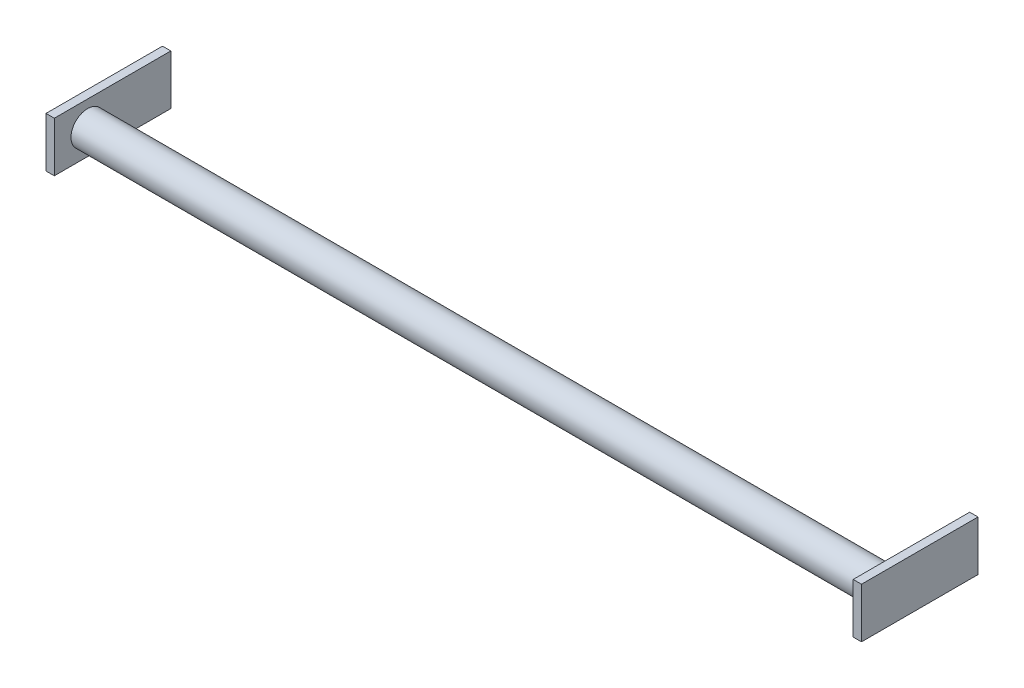
ISO-10303-21;
HEADER;
FILE_DESCRIPTION(('STEP AP214'),'2;1');
FILE_NAME('part.step','',(''),(''),'','','');
FILE_SCHEMA(('AUTOMOTIVE_DESIGN { 1 0 10303 214 1 1 1 1 }'));
ENDSEC;
DATA;
#1=APPLICATION_CONTEXT('core data for automotive mechanical design processes');
#2=APPLICATION_PROTOCOL_DEFINITION('international standard','automotive_design',2000,#1);
#3=PRODUCT_CONTEXT('',#1,'mechanical');
#4=PRODUCT('Part','Part','',(#3));
#5=PRODUCT_RELATED_PRODUCT_CATEGORY('part','',(#4));
#6=PRODUCT_DEFINITION_FORMATION('','',#4);
#7=PRODUCT_DEFINITION_CONTEXT('part definition',#1,'design');
#8=PRODUCT_DEFINITION('design','',#6,#7);
#9=PRODUCT_DEFINITION_SHAPE('','',#8);
#10=(LENGTH_UNIT() NAMED_UNIT(*) SI_UNIT(.MILLI.,.METRE.));
#11=(NAMED_UNIT(*) PLANE_ANGLE_UNIT() SI_UNIT($,.RADIAN.));
#12=(NAMED_UNIT(*) SI_UNIT($,.STERADIAN.) SOLID_ANGLE_UNIT());
#13=UNCERTAINTY_MEASURE_WITH_UNIT(LENGTH_MEASURE(1.E-05),#10,'distance_accuracy_value','');
#14=(GEOMETRIC_REPRESENTATION_CONTEXT(3) GLOBAL_UNCERTAINTY_ASSIGNED_CONTEXT((#13)) GLOBAL_UNIT_ASSIGNED_CONTEXT((#10,
#11,#12)) REPRESENTATION_CONTEXT('',''));
#15=CARTESIAN_POINT('',(0.,0.,0.));
#16=DIRECTION('',(0.,0.,1.));
#17=DIRECTION('',(1.,0.,0.));
#18=AXIS2_PLACEMENT_3D('',#15,#16,#17);
#19=CARTESIAN_POINT('',(304.8,0.,0.));
#20=DIRECTION('',(-1.,0.,0.));
#21=DIRECTION('',(0.,0.,1.));
#22=AXIS2_PLACEMENT_3D('',#19,#20,#21);
#23=CYLINDRICAL_SURFACE('',#22,12.7);
#24=CARTESIAN_POINT('',(304.8,0.,0.));
#25=DIRECTION('',(1.,0.,0.));
#26=DIRECTION('',(0.,0.,-1.));
#27=AXIS2_PLACEMENT_3D('',#24,#25,#26);
#28=CIRCLE('',#27,12.7);
#29=CARTESIAN_POINT('',(304.8,0.,12.7));
#30=VERTEX_POINT('',#29);
#31=EDGE_CURVE('E11',#30,#30,#28,.T.);
#32=CARTESIAN_POINT('',(-304.8,0.,0.));
#33=DIRECTION('',(1.,0.,0.));
#34=DIRECTION('',(0.,0.,-1.));
#35=AXIS2_PLACEMENT_3D('',#32,#33,#34);
#36=CIRCLE('',#35,12.7);
#37=CARTESIAN_POINT('',(-304.8,0.,12.7));
#38=VERTEX_POINT('',#37);
#39=EDGE_CURVE('E42',#38,#38,#36,.T.);
#40=CARTESIAN_POINT('',(304.8,0.,12.7));
#41=CARTESIAN_POINT('',(298.45,0.,12.7));
#42=CARTESIAN_POINT('',(292.1,0.,12.7));
#43=CARTESIAN_POINT('',(279.4,0.,12.7));
#44=CARTESIAN_POINT('',(273.05,0.,12.7));
#45=CARTESIAN_POINT('',(260.35,0.,12.7));
#46=CARTESIAN_POINT('',(254.,0.,12.7));
#47=CARTESIAN_POINT('',(241.3,0.,12.7));
#48=CARTESIAN_POINT('',(234.95,0.,12.7));
#49=CARTESIAN_POINT('',(222.25,0.,12.7));
#50=CARTESIAN_POINT('',(215.9,0.,12.7));
#51=CARTESIAN_POINT('',(203.2,0.,12.7));
#52=CARTESIAN_POINT('',(196.85,0.,12.7));
#53=CARTESIAN_POINT('',(184.15,0.,12.7));
#54=CARTESIAN_POINT('',(177.8,0.,12.7));
#55=CARTESIAN_POINT('',(165.1,0.,12.7));
#56=CARTESIAN_POINT('',(158.75,0.,12.7));
#57=CARTESIAN_POINT('',(146.05,0.,12.7));
#58=CARTESIAN_POINT('',(139.7,0.,12.7));
#59=CARTESIAN_POINT('',(127.,0.,12.7));
#60=CARTESIAN_POINT('',(120.65,0.,12.7));
#61=CARTESIAN_POINT('',(107.95,0.,12.7));
#62=CARTESIAN_POINT('',(101.6,0.,12.7));
#63=CARTESIAN_POINT('',(88.9,0.,12.7));
#64=CARTESIAN_POINT('',(82.55,0.,12.7));
#65=CARTESIAN_POINT('',(69.85,0.,12.7));
#66=CARTESIAN_POINT('',(63.5,0.,12.7));
#67=CARTESIAN_POINT('',(50.8,0.,12.7));
#68=CARTESIAN_POINT('',(44.45,0.,12.7));
#69=CARTESIAN_POINT('',(31.75,0.,12.7));
#70=CARTESIAN_POINT('',(25.4,0.,12.7));
#71=CARTESIAN_POINT('',(12.7,0.,12.7));
#72=CARTESIAN_POINT('',(6.35,0.,12.7));
#73=CARTESIAN_POINT('',(-6.35,0.,12.7));
#74=CARTESIAN_POINT('',(-12.7,0.,12.7));
#75=CARTESIAN_POINT('',(-25.4,0.,12.7));
#76=CARTESIAN_POINT('',(-31.75,0.,12.7));
#77=CARTESIAN_POINT('',(-44.45,0.,12.7));
#78=CARTESIAN_POINT('',(-50.8,0.,12.7));
#79=CARTESIAN_POINT('',(-63.5,0.,12.7));
#80=CARTESIAN_POINT('',(-69.85,0.,12.7));
#81=CARTESIAN_POINT('',(-82.55,0.,12.7));
#82=CARTESIAN_POINT('',(-88.9,0.,12.7));
#83=CARTESIAN_POINT('',(-101.6,0.,12.7));
#84=CARTESIAN_POINT('',(-107.95,0.,12.7));
#85=CARTESIAN_POINT('',(-120.65,0.,12.7));
#86=CARTESIAN_POINT('',(-127.,0.,12.7));
#87=CARTESIAN_POINT('',(-139.7,0.,12.7));
#88=CARTESIAN_POINT('',(-146.05,0.,12.7));
#89=CARTESIAN_POINT('',(-158.75,0.,12.7));
#90=CARTESIAN_POINT('',(-165.1,0.,12.7));
#91=CARTESIAN_POINT('',(-177.8,0.,12.7));
#92=CARTESIAN_POINT('',(-184.15,0.,12.7));
#93=CARTESIAN_POINT('',(-196.85,0.,12.7));
#94=CARTESIAN_POINT('',(-203.2,0.,12.7));
#95=CARTESIAN_POINT('',(-215.9,0.,12.7));
#96=CARTESIAN_POINT('',(-222.25,0.,12.7));
#97=CARTESIAN_POINT('',(-234.95,0.,12.7));
#98=CARTESIAN_POINT('',(-241.3,0.,12.7));
#99=CARTESIAN_POINT('',(-254.,0.,12.7));
#100=CARTESIAN_POINT('',(-260.35,0.,12.7));
#101=CARTESIAN_POINT('',(-273.05,0.,12.7));
#102=CARTESIAN_POINT('',(-279.4,0.,12.7));
#103=CARTESIAN_POINT('',(-292.1,0.,12.7));
#104=CARTESIAN_POINT('',(-298.45,0.,12.7));
#105=CARTESIAN_POINT('',(-304.8,0.,12.7));
#106=B_SPLINE_CURVE_WITH_KNOTS('',3,(#40,#41,#42,#43,#44,#45,#46,#47,#48,#49,#50,#51,#52,#53,
#54,#55,#56,#57,#58,#59,#60,#61,#62,#63,#64,#65,#66,#67,#68,#69,#70,#71,#72,#73,#74,#75,#76,#77,
#78,#79,#80,#81,#82,#83,#84,#85,#86,#87,#88,#89,#90,#91,#92,#93,#94,#95,#96,#97,#98,#99,#100,
#101,#102,#103,#104,#105),.UNSPECIFIED.,.F.,.F.,(4,2,2,2,2,2,2,2,2,2,2,2,2,2,2,2,2,2,2,2,2,2,2,
2,2,2,2,2,2,2,2,2,4),(0.,19.05,38.1,57.15,76.2,95.2500000000001,114.3,133.35,152.4,171.45,190.5,
209.55,228.6,247.65,266.7,285.75,304.8,323.85,342.9,361.95,381.,400.05,419.1,438.15,457.2,
476.25,495.3,514.35,533.4,552.45,571.5,590.55,609.6),.UNSPECIFIED.);
#107=EDGE_CURVE('BSEAM39',#30,#38,#106,.T.);
#108=ORIENTED_EDGE('',*,*,#31,.F.);
#109=ORIENTED_EDGE('',*,*,#39,.T.);
#110=ORIENTED_EDGE('',*,*,#107,.T.);
#111=ORIENTED_EDGE('',*,*,#107,.F.);
#112=EDGE_LOOP('',(#108,#110,#109,#111));
#113=FACE_BOUND('',#112,.T.);
#114=ADVANCED_FACE('F39',(#113),#23,.T.);
#115=CARTESIAN_POINT('',(311.15,19.05,25.4));
#116=DIRECTION('',(0.,0.,-1.));
#117=DIRECTION('',(-1.,0.,0.));
#118=AXIS2_PLACEMENT_3D('',#115,#116,#117);
#119=PLANE('',#118);
#120=DIRECTION('',(0.,-1.,0.));
#121=VECTOR('',#120,1.);
#122=CARTESIAN_POINT('',(304.8,19.05,25.4));
#123=LINE('',#122,#121);
#124=CARTESIAN_POINT('',(304.8,19.05,25.4));
#125=VERTEX_POINT('',#124);
#126=CARTESIAN_POINT('',(304.8,-19.05,25.4));
#127=VERTEX_POINT('',#126);
#128=EDGE_CURVE('E181',#125,#127,#123,.T.);
#129=ORIENTED_EDGE('',*,*,#128,.T.);
#130=DIRECTION('',(-1.,0.,0.));
#131=VECTOR('',#130,1.);
#132=CARTESIAN_POINT('',(311.15,-19.05,25.4));
#133=LINE('',#132,#131);
#134=CARTESIAN_POINT('',(311.15,-19.05,25.4));
#135=VERTEX_POINT('',#134);
#136=EDGE_CURVE('E49',#135,#127,#133,.T.);
#137=ORIENTED_EDGE('',*,*,#136,.F.);
#138=DIRECTION('',(0.,-1.,0.));
#139=VECTOR('',#138,1.);
#140=CARTESIAN_POINT('',(311.15,19.05,25.4));
#141=LINE('',#140,#139);
#142=CARTESIAN_POINT('',(311.15,19.05,25.4));
#143=VERTEX_POINT('',#142);
#144=EDGE_CURVE('E170',#143,#135,#141,.T.);
#145=ORIENTED_EDGE('',*,*,#144,.F.);
#146=DIRECTION('',(-1.,0.,0.));
#147=VECTOR('',#146,1.);
#148=CARTESIAN_POINT('',(311.15,19.05,25.4));
#149=LINE('',#148,#147);
#150=EDGE_CURVE('E180',#143,#125,#149,.T.);
#151=ORIENTED_EDGE('',*,*,#150,.T.);
#152=EDGE_LOOP('',(#129,#137,#145,#151));
#153=FACE_BOUND('',#152,.T.);
#154=ADVANCED_FACE('F206',(#153),#119,.F.);
#155=CARTESIAN_POINT('',(311.15,-19.05,25.4));
#156=DIRECTION('',(0.,1.,0.));
#157=DIRECTION('',(0.,0.,1.));
#158=AXIS2_PLACEMENT_3D('',#155,#156,#157);
#159=PLANE('',#158);
#160=DIRECTION('',(0.,0.,-1.));
#161=VECTOR('',#160,1.);
#162=CARTESIAN_POINT('',(304.8,-19.05,25.4));
#163=LINE('',#162,#161);
#164=CARTESIAN_POINT('',(304.8,-19.05,-63.5));
#165=VERTEX_POINT('',#164);
#166=EDGE_CURVE('E185',#127,#165,#163,.T.);
#167=ORIENTED_EDGE('',*,*,#166,.T.);
#168=DIRECTION('',(-1.,0.,0.));
#169=VECTOR('',#168,1.);
#170=CARTESIAN_POINT('',(311.15,-19.05,-63.5));
#171=LINE('',#170,#169);
#172=CARTESIAN_POINT('',(311.15,-19.05,-63.5));
#173=VERTEX_POINT('',#172);
#174=EDGE_CURVE('E197',#173,#165,#171,.T.);
#175=ORIENTED_EDGE('',*,*,#174,.F.);
#176=DIRECTION('',(0.,0.,-1.));
#177=VECTOR('',#176,1.);
#178=CARTESIAN_POINT('',(311.15,-19.05,25.4));
#179=LINE('',#178,#177);
#180=EDGE_CURVE('E89',#135,#173,#179,.T.);
#181=ORIENTED_EDGE('',*,*,#180,.F.);
#182=ORIENTED_EDGE('',*,*,#136,.T.);
#183=EDGE_LOOP('',(#167,#175,#181,#182));
#184=FACE_BOUND('',#183,.T.);
#185=ADVANCED_FACE('F202',(#184),#159,.F.);
#186=CARTESIAN_POINT('',(311.15,19.05,-63.5));
#187=DIRECTION('',(0.,0.,1.));
#188=DIRECTION('',(1.,0.,0.));
#189=AXIS2_PLACEMENT_3D('',#186,#187,#188);
#190=PLANE('',#189);
#191=DIRECTION('',(0.,1.,0.));
#192=VECTOR('',#191,1.);
#193=CARTESIAN_POINT('',(304.8,19.05,-63.5));
#194=LINE('',#193,#192);
#195=CARTESIAN_POINT('',(304.8,19.05,-63.5));
#196=VERTEX_POINT('',#195);
#197=EDGE_CURVE('E75',#165,#196,#194,.T.);
#198=ORIENTED_EDGE('',*,*,#197,.T.);
#199=DIRECTION('',(-1.,0.,0.));
#200=VECTOR('',#199,1.);
#201=CARTESIAN_POINT('',(311.15,19.05,-63.5));
#202=LINE('',#201,#200);
#203=CARTESIAN_POINT('',(311.15,19.05,-63.5));
#204=VERTEX_POINT('',#203);
#205=EDGE_CURVE('E194',#204,#196,#202,.T.);
#206=ORIENTED_EDGE('',*,*,#205,.F.);
#207=DIRECTION('',(0.,1.,0.));
#208=VECTOR('',#207,1.);
#209=CARTESIAN_POINT('',(311.15,19.05,-63.5));
#210=LINE('',#209,#208);
#211=EDGE_CURVE('E175',#173,#204,#210,.T.);
#212=ORIENTED_EDGE('',*,*,#211,.F.);
#213=ORIENTED_EDGE('',*,*,#174,.T.);
#214=EDGE_LOOP('',(#198,#206,#212,#213));
#215=FACE_BOUND('',#214,.T.);
#216=ADVANCED_FACE('F299',(#215),#190,.F.);
#217=CARTESIAN_POINT('',(311.15,19.05,25.4));
#218=DIRECTION('',(0.,-1.,0.));
#219=DIRECTION('',(0.,0.,-1.));
#220=AXIS2_PLACEMENT_3D('',#217,#218,#219);
#221=PLANE('',#220);
#222=DIRECTION('',(0.,0.,1.));
#223=VECTOR('',#222,1.);
#224=CARTESIAN_POINT('',(304.8,19.05,25.4));
#225=LINE('',#224,#223);
#226=EDGE_CURVE('E81',#196,#125,#225,.T.);
#227=ORIENTED_EDGE('',*,*,#226,.T.);
#228=ORIENTED_EDGE('',*,*,#150,.F.);
#229=DIRECTION('',(0.,0.,1.));
#230=VECTOR('',#229,1.);
#231=CARTESIAN_POINT('',(311.15,19.05,25.4));
#232=LINE('',#231,#230);
#233=EDGE_CURVE('E57',#204,#143,#232,.T.);
#234=ORIENTED_EDGE('',*,*,#233,.F.);
#235=ORIENTED_EDGE('',*,*,#205,.T.);
#236=EDGE_LOOP('',(#227,#228,#234,#235));
#237=FACE_BOUND('',#236,.T.);
#238=ADVANCED_FACE('F218',(#237),#221,.F.);
#239=CARTESIAN_POINT('',(311.15,0.,0.));
#240=DIRECTION('',(1.,0.,0.));
#241=DIRECTION('',(0.,0.,-1.));
#242=AXIS2_PLACEMENT_3D('',#239,#240,#241);
#243=PLANE('',#242);
#244=ORIENTED_EDGE('',*,*,#144,.T.);
#245=ORIENTED_EDGE('',*,*,#180,.T.);
#246=ORIENTED_EDGE('',*,*,#211,.T.);
#247=ORIENTED_EDGE('',*,*,#233,.T.);
#248=EDGE_LOOP('',(#244,#245,#246,#247));
#249=FACE_BOUND('',#248,.T.);
#250=ADVANCED_FACE('F210',(#249),#243,.T.);
#251=CARTESIAN_POINT('',(304.8,0.,0.));
#252=DIRECTION('',(1.,0.,0.));
#253=DIRECTION('',(0.,0.,-1.));
#254=AXIS2_PLACEMENT_3D('',#251,#252,#253);
#255=PLANE('',#254);
#256=ORIENTED_EDGE('',*,*,#31,.T.);
#257=EDGE_LOOP('',(#256));
#258=FACE_BOUND('',#257,.T.);
#259=ORIENTED_EDGE('',*,*,#128,.F.);
#260=ORIENTED_EDGE('',*,*,#226,.F.);
#261=ORIENTED_EDGE('',*,*,#197,.F.);
#262=ORIENTED_EDGE('',*,*,#166,.F.);
#263=EDGE_LOOP('',(#259,#260,#261,#262));
#264=FACE_BOUND('',#263,.T.);
#265=ADVANCED_FACE('F208',(#258,#264),#255,.F.);
#266=CARTESIAN_POINT('',(-311.15,19.05,25.4));
#267=DIRECTION('',(0.,0.,1.));
#268=DIRECTION('',(1.,0.,0.));
#269=AXIS2_PLACEMENT_3D('',#266,#267,#268);
#270=PLANE('',#269);
#271=DIRECTION('',(0.,-1.,0.));
#272=VECTOR('',#271,1.);
#273=CARTESIAN_POINT('',(-304.8,19.05,25.4));
#274=LINE('',#273,#272);
#275=CARTESIAN_POINT('',(-304.8,19.05,25.4));
#276=VERTEX_POINT('',#275);
#277=CARTESIAN_POINT('',(-304.8,-19.05,25.4));
#278=VERTEX_POINT('',#277);
#279=EDGE_CURVE('E122',#276,#278,#274,.T.);
#280=ORIENTED_EDGE('',*,*,#279,.F.);
#281=DIRECTION('',(1.,0.,0.));
#282=VECTOR('',#281,1.);
#283=CARTESIAN_POINT('',(-311.15,19.05,25.4));
#284=LINE('',#283,#282);
#285=CARTESIAN_POINT('',(-311.15,19.05,25.4));
#286=VERTEX_POINT('',#285);
#287=EDGE_CURVE('E116',#286,#276,#284,.T.);
#288=ORIENTED_EDGE('',*,*,#287,.F.);
#289=DIRECTION('',(0.,-1.,0.));
#290=VECTOR('',#289,1.);
#291=CARTESIAN_POINT('',(-311.15,19.05,25.4));
#292=LINE('',#291,#290);
#293=CARTESIAN_POINT('',(-311.15,-19.05,25.4));
#294=VERTEX_POINT('',#293);
#295=EDGE_CURVE('E119',#286,#294,#292,.T.);
#296=ORIENTED_EDGE('',*,*,#295,.T.);
#297=DIRECTION('',(1.,0.,0.));
#298=VECTOR('',#297,1.);
#299=CARTESIAN_POINT('',(-311.15,-19.05,25.4));
#300=LINE('',#299,#298);
#301=EDGE_CURVE('E150',#294,#278,#300,.T.);
#302=ORIENTED_EDGE('',*,*,#301,.T.);
#303=EDGE_LOOP('',(#280,#288,#296,#302));
#304=FACE_BOUND('',#303,.T.);
#305=ADVANCED_FACE('F118',(#304),#270,.T.);
#306=CARTESIAN_POINT('',(-311.15,19.05,25.4));
#307=DIRECTION('',(0.,1.,0.));
#308=DIRECTION('',(0.,0.,1.));
#309=AXIS2_PLACEMENT_3D('',#306,#307,#308);
#310=PLANE('',#309);
#311=DIRECTION('',(0.,0.,1.));
#312=VECTOR('',#311,1.);
#313=CARTESIAN_POINT('',(-304.8,19.05,25.4));
#314=LINE('',#313,#312);
#315=CARTESIAN_POINT('',(-304.8,19.05,-63.5));
#316=VERTEX_POINT('',#315);
#317=EDGE_CURVE('E153',#316,#276,#314,.T.);
#318=ORIENTED_EDGE('',*,*,#317,.F.);
#319=DIRECTION('',(1.,0.,0.));
#320=VECTOR('',#319,1.);
#321=CARTESIAN_POINT('',(-311.15,19.05,-63.5));
#322=LINE('',#321,#320);
#323=CARTESIAN_POINT('',(-311.15,19.05,-63.5));
#324=VERTEX_POINT('',#323);
#325=EDGE_CURVE('E128',#324,#316,#322,.T.);
#326=ORIENTED_EDGE('',*,*,#325,.F.);
#327=DIRECTION('',(0.,0.,1.));
#328=VECTOR('',#327,1.);
#329=CARTESIAN_POINT('',(-311.15,19.05,25.4));
#330=LINE('',#329,#328);
#331=EDGE_CURVE('E134',#324,#286,#330,.T.);
#332=ORIENTED_EDGE('',*,*,#331,.T.);
#333=ORIENTED_EDGE('',*,*,#287,.T.);
#334=EDGE_LOOP('',(#318,#326,#332,#333));
#335=FACE_BOUND('',#334,.T.);
#336=ADVANCED_FACE('F141',(#335),#310,.T.);
#337=CARTESIAN_POINT('',(-311.15,19.05,-63.5));
#338=DIRECTION('',(0.,0.,-1.));
#339=DIRECTION('',(-1.,0.,0.));
#340=AXIS2_PLACEMENT_3D('',#337,#338,#339);
#341=PLANE('',#340);
#342=DIRECTION('',(0.,1.,0.));
#343=VECTOR('',#342,1.);
#344=CARTESIAN_POINT('',(-304.8,19.05,-63.5));
#345=LINE('',#344,#343);
#346=CARTESIAN_POINT('',(-304.8,-19.05,-63.5));
#347=VERTEX_POINT('',#346);
#348=EDGE_CURVE('E156',#347,#316,#345,.T.);
#349=ORIENTED_EDGE('',*,*,#348,.F.);
#350=DIRECTION('',(1.,0.,0.));
#351=VECTOR('',#350,1.);
#352=CARTESIAN_POINT('',(-311.15,-19.05,-63.5));
#353=LINE('',#352,#351);
#354=CARTESIAN_POINT('',(-311.15,-19.05,-63.5));
#355=VERTEX_POINT('',#354);
#356=EDGE_CURVE('E165',#355,#347,#353,.T.);
#357=ORIENTED_EDGE('',*,*,#356,.F.);
#358=DIRECTION('',(0.,1.,0.));
#359=VECTOR('',#358,1.);
#360=CARTESIAN_POINT('',(-311.15,19.05,-63.5));
#361=LINE('',#360,#359);
#362=EDGE_CURVE('E143',#355,#324,#361,.T.);
#363=ORIENTED_EDGE('',*,*,#362,.T.);
#364=ORIENTED_EDGE('',*,*,#325,.T.);
#365=EDGE_LOOP('',(#349,#357,#363,#364));
#366=FACE_BOUND('',#365,.T.);
#367=ADVANCED_FACE('F241',(#366),#341,.T.);
#368=CARTESIAN_POINT('',(-311.15,-19.05,25.4));
#369=DIRECTION('',(0.,-1.,0.));
#370=DIRECTION('',(0.,0.,-1.));
#371=AXIS2_PLACEMENT_3D('',#368,#369,#370);
#372=PLANE('',#371);
#373=DIRECTION('',(0.,0.,-1.));
#374=VECTOR('',#373,1.);
#375=CARTESIAN_POINT('',(-304.8,-19.05,25.4));
#376=LINE('',#375,#374);
#377=EDGE_CURVE('E139',#278,#347,#376,.T.);
#378=ORIENTED_EDGE('',*,*,#377,.F.);
#379=ORIENTED_EDGE('',*,*,#301,.F.);
#380=DIRECTION('',(0.,0.,-1.));
#381=VECTOR('',#380,1.);
#382=CARTESIAN_POINT('',(-311.15,-19.05,25.4));
#383=LINE('',#382,#381);
#384=EDGE_CURVE('E137',#294,#355,#383,.T.);
#385=ORIENTED_EDGE('',*,*,#384,.T.);
#386=ORIENTED_EDGE('',*,*,#356,.T.);
#387=EDGE_LOOP('',(#378,#379,#385,#386));
#388=FACE_BOUND('',#387,.T.);
#389=ADVANCED_FACE('F238',(#388),#372,.T.);
#390=CARTESIAN_POINT('',(-311.15,0.,0.));
#391=DIRECTION('',(-1.,0.,0.));
#392=DIRECTION('',(0.,0.,-1.));
#393=AXIS2_PLACEMENT_3D('',#390,#391,#392);
#394=PLANE('',#393);
#395=ORIENTED_EDGE('',*,*,#295,.F.);
#396=ORIENTED_EDGE('',*,*,#331,.F.);
#397=ORIENTED_EDGE('',*,*,#362,.F.);
#398=ORIENTED_EDGE('',*,*,#384,.F.);
#399=EDGE_LOOP('',(#395,#396,#397,#398));
#400=FACE_BOUND('',#399,.T.);
#401=ADVANCED_FACE('F132',(#400),#394,.T.);
#402=CARTESIAN_POINT('',(-304.8,0.,0.));
#403=DIRECTION('',(-1.,0.,0.));
#404=DIRECTION('',(0.,0.,-1.));
#405=AXIS2_PLACEMENT_3D('',#402,#403,#404);
#406=PLANE('',#405);
#407=ORIENTED_EDGE('',*,*,#39,.F.);
#408=EDGE_LOOP('',(#407));
#409=FACE_BOUND('',#408,.T.);
#410=ORIENTED_EDGE('',*,*,#279,.T.);
#411=ORIENTED_EDGE('',*,*,#377,.T.);
#412=ORIENTED_EDGE('',*,*,#348,.T.);
#413=ORIENTED_EDGE('',*,*,#317,.T.);
#414=EDGE_LOOP('',(#410,#411,#412,#413));
#415=FACE_BOUND('',#414,.T.);
#416=ADVANCED_FACE('F232',(#409,#415),#406,.F.);
#417=CLOSED_SHELL('',(#114,#154,#185,#216,#238,#250,#265,#305,#336,#367,#389,#401,#416));
#418=MANIFOLD_SOLID_BREP('B2',#417);
#419=ADVANCED_BREP_SHAPE_REPRESENTATION('',(#18,#418),#14);
#420=SHAPE_DEFINITION_REPRESENTATION(#9,#419);
ENDSEC;
END-ISO-10303-21;
